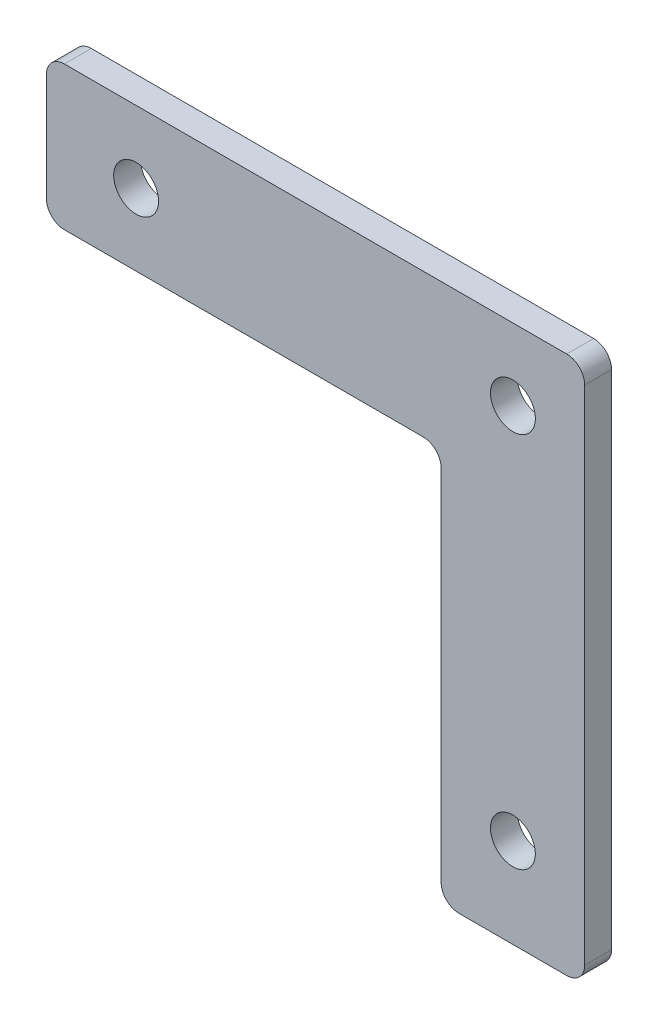
ISO-10303-21;
HEADER;
FILE_DESCRIPTION(('STEP AP214'),'2;1');
FILE_NAME('part.step','',(''),(''),'','','');
FILE_SCHEMA(('AUTOMOTIVE_DESIGN { 1 0 10303 214 1 1 1 1 }'));
ENDSEC;
DATA;
#1=APPLICATION_CONTEXT('core data for automotive mechanical design processes');
#2=APPLICATION_PROTOCOL_DEFINITION('international standard','automotive_design',2000,#1);
#3=PRODUCT_CONTEXT('',#1,'mechanical');
#4=PRODUCT('Part','Part','',(#3));
#5=PRODUCT_RELATED_PRODUCT_CATEGORY('part','',(#4));
#6=PRODUCT_DEFINITION_FORMATION('','',#4);
#7=PRODUCT_DEFINITION_CONTEXT('part definition',#1,'design');
#8=PRODUCT_DEFINITION('design','',#6,#7);
#9=PRODUCT_DEFINITION_SHAPE('','',#8);
#10=(LENGTH_UNIT() NAMED_UNIT(*) SI_UNIT(.MILLI.,.METRE.));
#11=(NAMED_UNIT(*) PLANE_ANGLE_UNIT() SI_UNIT($,.RADIAN.));
#12=(NAMED_UNIT(*) SI_UNIT($,.STERADIAN.) SOLID_ANGLE_UNIT());
#13=UNCERTAINTY_MEASURE_WITH_UNIT(LENGTH_MEASURE(1.E-05),#10,'distance_accuracy_value','');
#14=(GEOMETRIC_REPRESENTATION_CONTEXT(3) GLOBAL_UNCERTAINTY_ASSIGNED_CONTEXT((#13)) GLOBAL_UNIT_ASSIGNED_CONTEXT((#10,
#11,#12)) REPRESENTATION_CONTEXT('',''));
#15=CARTESIAN_POINT('',(0.,0.,0.));
#16=DIRECTION('',(0.,0.,1.));
#17=DIRECTION('',(1.,0.,0.));
#18=AXIS2_PLACEMENT_3D('',#15,#16,#17);
#19=CARTESIAN_POINT('',(0.,0.,3.));
#20=DIRECTION('',(1.,0.,0.));
#21=DIRECTION('',(0.,0.,-1.));
#22=AXIS2_PLACEMENT_3D('',#19,#20,#21);
#23=PLANE('',#22);
#24=DIRECTION('',(0.,-1.,0.));
#25=VECTOR('',#24,1.);
#26=CARTESIAN_POINT('',(0.,0.,3.));
#27=LINE('',#26,#25);
#28=CARTESIAN_POINT('',(0.,14.,3.));
#29=VERTEX_POINT('',#28);
#30=CARTESIAN_POINT('',(0.,2.,3.));
#31=VERTEX_POINT('',#30);
#32=EDGE_CURVE('E159',#29,#31,#27,.T.);
#33=ORIENTED_EDGE('',*,*,#32,.F.);
#34=DIRECTION('',(0.,0.,-1.));
#35=VECTOR('',#34,1.);
#36=CARTESIAN_POINT('',(0.,14.,3.));
#37=LINE('',#36,#35);
#38=CARTESIAN_POINT('',(0.,14.,0.));
#39=VERTEX_POINT('',#38);
#40=EDGE_CURVE('E196',#29,#39,#37,.T.);
#41=ORIENTED_EDGE('',*,*,#40,.T.);
#42=DIRECTION('',(0.,-1.,0.));
#43=VECTOR('',#42,1.);
#44=CARTESIAN_POINT('',(0.,0.,0.));
#45=LINE('',#44,#43);
#46=CARTESIAN_POINT('',(0.,2.,0.));
#47=VERTEX_POINT('',#46);
#48=EDGE_CURVE('E208',#39,#47,#45,.T.);
#49=ORIENTED_EDGE('',*,*,#48,.T.);
#50=DIRECTION('',(0.,0.,-1.));
#51=VECTOR('',#50,1.);
#52=CARTESIAN_POINT('',(0.,2.,3.));
#53=LINE('',#52,#51);
#54=EDGE_CURVE('E194',#47,#31,#53,.F.);
#55=ORIENTED_EDGE('',*,*,#54,.T.);
#56=EDGE_LOOP('',(#33,#41,#49,#55));
#57=FACE_BOUND('',#56,.T.);
#58=ADVANCED_FACE('F32',(#57),#23,.F.);
#59=CARTESIAN_POINT('',(0.,0.,3.));
#60=DIRECTION('',(0.,1.,0.));
#61=DIRECTION('',(0.,0.,1.));
#62=AXIS2_PLACEMENT_3D('',#59,#60,#61);
#63=PLANE('',#62);
#64=DIRECTION('',(1.,0.,0.));
#65=VECTOR('',#64,1.);
#66=CARTESIAN_POINT('',(0.,0.,0.));
#67=LINE('',#66,#65);
#68=CARTESIAN_POINT('',(2.,0.,0.));
#69=VERTEX_POINT('',#68);
#70=CARTESIAN_POINT('',(42.,0.,0.));
#71=VERTEX_POINT('',#70);
#72=EDGE_CURVE('E154',#69,#71,#67,.T.);
#73=ORIENTED_EDGE('',*,*,#72,.T.);
#74=DIRECTION('',(0.,0.,-1.));
#75=VECTOR('',#74,1.);
#76=CARTESIAN_POINT('',(42.,0.,3.));
#77=LINE('',#76,#75);
#78=CARTESIAN_POINT('',(42.,0.,3.));
#79=VERTEX_POINT('',#78);
#80=EDGE_CURVE('E188',#71,#79,#77,.F.);
#81=ORIENTED_EDGE('',*,*,#80,.T.);
#82=DIRECTION('',(1.,0.,0.));
#83=VECTOR('',#82,1.);
#84=CARTESIAN_POINT('',(0.,0.,3.));
#85=LINE('',#84,#83);
#86=CARTESIAN_POINT('',(2.,0.,3.));
#87=VERTEX_POINT('',#86);
#88=EDGE_CURVE('E215',#87,#79,#85,.T.);
#89=ORIENTED_EDGE('',*,*,#88,.F.);
#90=DIRECTION('',(0.,0.,-1.));
#91=VECTOR('',#90,1.);
#92=CARTESIAN_POINT('',(2.,0.,3.));
#93=LINE('',#92,#91);
#94=EDGE_CURVE('E185',#87,#69,#93,.T.);
#95=ORIENTED_EDGE('',*,*,#94,.T.);
#96=EDGE_LOOP('',(#73,#81,#89,#95));
#97=FACE_BOUND('',#96,.T.);
#98=ADVANCED_FACE('F204',(#97),#63,.F.);
#99=CARTESIAN_POINT('',(44.,0.,3.));
#100=DIRECTION('',(1.,0.,0.));
#101=DIRECTION('',(0.,1.,0.));
#102=AXIS2_PLACEMENT_3D('',#99,#100,#101);
#103=PLANE('',#102);
#104=DIRECTION('',(0.,-1.,0.));
#105=VECTOR('',#104,1.);
#106=CARTESIAN_POINT('',(44.,0.,0.));
#107=LINE('',#106,#105);
#108=CARTESIAN_POINT('',(44.,-2.,0.));
#109=VERTEX_POINT('',#108);
#110=CARTESIAN_POINT('',(44.,-42.,0.));
#111=VERTEX_POINT('',#110);
#112=EDGE_CURVE('E149',#109,#111,#107,.T.);
#113=ORIENTED_EDGE('',*,*,#112,.T.);
#114=DIRECTION('',(0.,0.,-1.));
#115=VECTOR('',#114,1.);
#116=CARTESIAN_POINT('',(44.,-42.,3.));
#117=LINE('',#116,#115);
#118=CARTESIAN_POINT('',(44.,-42.,3.));
#119=VERTEX_POINT('',#118);
#120=EDGE_CURVE('E127',#111,#119,#117,.F.);
#121=ORIENTED_EDGE('',*,*,#120,.T.);
#122=DIRECTION('',(0.,-1.,0.));
#123=VECTOR('',#122,1.);
#124=CARTESIAN_POINT('',(44.,0.,3.));
#125=LINE('',#124,#123);
#126=CARTESIAN_POINT('',(44.,-2.,3.));
#127=VERTEX_POINT('',#126);
#128=EDGE_CURVE('E214',#127,#119,#125,.T.);
#129=ORIENTED_EDGE('',*,*,#128,.F.);
#130=DIRECTION('',(0.,0.,-1.));
#131=VECTOR('',#130,1.);
#132=CARTESIAN_POINT('',(44.,-2.,0.));
#133=LINE('',#132,#131);
#134=EDGE_CURVE('E132',#127,#109,#133,.T.);
#135=ORIENTED_EDGE('',*,*,#134,.T.);
#136=EDGE_LOOP('',(#113,#121,#129,#135));
#137=FACE_BOUND('',#136,.T.);
#138=ADVANCED_FACE('F217',(#137),#103,.F.);
#139=CARTESIAN_POINT('',(60.,-44.,3.));
#140=DIRECTION('',(0.,1.,0.));
#141=DIRECTION('',(-1.,0.,0.));
#142=AXIS2_PLACEMENT_3D('',#139,#140,#141);
#143=PLANE('',#142);
#144=DIRECTION('',(1.,0.,0.));
#145=VECTOR('',#144,1.);
#146=CARTESIAN_POINT('',(60.,-44.,3.));
#147=LINE('',#146,#145);
#148=CARTESIAN_POINT('',(46.,-44.,3.));
#149=VERTEX_POINT('',#148);
#150=CARTESIAN_POINT('',(58.,-44.,3.));
#151=VERTEX_POINT('',#150);
#152=EDGE_CURVE('E142',#149,#151,#147,.T.);
#153=ORIENTED_EDGE('',*,*,#152,.F.);
#154=DIRECTION('',(0.,0.,-1.));
#155=VECTOR('',#154,1.);
#156=CARTESIAN_POINT('',(46.,-44.,3.));
#157=LINE('',#156,#155);
#158=CARTESIAN_POINT('',(46.,-44.,0.));
#159=VERTEX_POINT('',#158);
#160=EDGE_CURVE('E126',#149,#159,#157,.T.);
#161=ORIENTED_EDGE('',*,*,#160,.T.);
#162=DIRECTION('',(1.,0.,0.));
#163=VECTOR('',#162,1.);
#164=CARTESIAN_POINT('',(60.,-44.,0.));
#165=LINE('',#164,#163);
#166=CARTESIAN_POINT('',(58.,-44.,0.));
#167=VERTEX_POINT('',#166);
#168=EDGE_CURVE('E139',#159,#167,#165,.T.);
#169=ORIENTED_EDGE('',*,*,#168,.T.);
#170=DIRECTION('',(0.,0.,-1.));
#171=VECTOR('',#170,1.);
#172=CARTESIAN_POINT('',(58.,-44.,3.));
#173=LINE('',#172,#171);
#174=EDGE_CURVE('E144',#167,#151,#173,.F.);
#175=ORIENTED_EDGE('',*,*,#174,.T.);
#176=EDGE_LOOP('',(#153,#161,#169,#175));
#177=FACE_BOUND('',#176,.T.);
#178=ADVANCED_FACE('F138',(#177),#143,.F.);
#179=CARTESIAN_POINT('',(60.,-15.6568041730529,3.));
#180=DIRECTION('',(-1.,0.,0.));
#181=DIRECTION('',(0.,0.,1.));
#182=AXIS2_PLACEMENT_3D('',#179,#180,#181);
#183=PLANE('',#182);
#184=DIRECTION('',(0.,1.,0.));
#185=VECTOR('',#184,1.);
#186=CARTESIAN_POINT('',(60.,-15.6568041730529,3.));
#187=LINE('',#186,#185);
#188=CARTESIAN_POINT('',(60.,-42.,3.));
#189=VERTEX_POINT('',#188);
#190=CARTESIAN_POINT('',(60.,14.,3.));
#191=VERTEX_POINT('',#190);
#192=EDGE_CURVE('E219',#189,#191,#187,.T.);
#193=ORIENTED_EDGE('',*,*,#192,.F.);
#194=DIRECTION('',(0.,0.,-1.));
#195=VECTOR('',#194,1.);
#196=CARTESIAN_POINT('',(60.,-42.,3.));
#197=LINE('',#196,#195);
#198=CARTESIAN_POINT('',(60.,-42.,0.));
#199=VERTEX_POINT('',#198);
#200=EDGE_CURVE('E182',#189,#199,#197,.T.);
#201=ORIENTED_EDGE('',*,*,#200,.T.);
#202=DIRECTION('',(0.,1.,0.));
#203=VECTOR('',#202,1.);
#204=CARTESIAN_POINT('',(60.,-15.6568041730529,0.));
#205=LINE('',#204,#203);
#206=CARTESIAN_POINT('',(60.,14.,0.));
#207=VERTEX_POINT('',#206);
#208=EDGE_CURVE('E148',#199,#207,#205,.T.);
#209=ORIENTED_EDGE('',*,*,#208,.T.);
#210=DIRECTION('',(0.,0.,-1.));
#211=VECTOR('',#210,1.);
#212=CARTESIAN_POINT('',(60.,14.,3.));
#213=LINE('',#212,#211);
#214=EDGE_CURVE('E180',#207,#191,#213,.F.);
#215=ORIENTED_EDGE('',*,*,#214,.T.);
#216=EDGE_LOOP('',(#193,#201,#209,#215));
#217=FACE_BOUND('',#216,.T.);
#218=ADVANCED_FACE('F308',(#217),#183,.F.);
#219=CARTESIAN_POINT('',(0.,16.,3.));
#220=DIRECTION('',(0.,-1.,0.));
#221=DIRECTION('',(0.,0.,-1.));
#222=AXIS2_PLACEMENT_3D('',#219,#220,#221);
#223=PLANE('',#222);
#224=DIRECTION('',(-1.,0.,0.));
#225=VECTOR('',#224,1.);
#226=CARTESIAN_POINT('',(0.,16.,3.));
#227=LINE('',#226,#225);
#228=CARTESIAN_POINT('',(58.,16.,3.));
#229=VERTEX_POINT('',#228);
#230=CARTESIAN_POINT('',(2.,16.,3.));
#231=VERTEX_POINT('',#230);
#232=EDGE_CURVE('E160',#229,#231,#227,.T.);
#233=ORIENTED_EDGE('',*,*,#232,.F.);
#234=DIRECTION('',(0.,0.,-1.));
#235=VECTOR('',#234,1.);
#236=CARTESIAN_POINT('',(58.,16.,3.));
#237=LINE('',#236,#235);
#238=CARTESIAN_POINT('',(58.,16.,0.));
#239=VERTEX_POINT('',#238);
#240=EDGE_CURVE('E191',#229,#239,#237,.T.);
#241=ORIENTED_EDGE('',*,*,#240,.T.);
#242=DIRECTION('',(-1.,0.,0.));
#243=VECTOR('',#242,1.);
#244=CARTESIAN_POINT('',(0.,16.,0.));
#245=LINE('',#244,#243);
#246=CARTESIAN_POINT('',(2.,16.,0.));
#247=VERTEX_POINT('',#246);
#248=EDGE_CURVE('E152',#239,#247,#245,.T.);
#249=ORIENTED_EDGE('',*,*,#248,.T.);
#250=DIRECTION('',(0.,0.,-1.));
#251=VECTOR('',#250,1.);
#252=CARTESIAN_POINT('',(2.,16.,3.));
#253=LINE('',#252,#251);
#254=EDGE_CURVE('E47',#247,#231,#253,.F.);
#255=ORIENTED_EDGE('',*,*,#254,.T.);
#256=EDGE_LOOP('',(#233,#241,#249,#255));
#257=FACE_BOUND('',#256,.T.);
#258=ADVANCED_FACE('F255',(#257),#223,.F.);
#259=CARTESIAN_POINT('',(0.,0.,3.));
#260=DIRECTION('',(0.,0.,-1.));
#261=DIRECTION('',(-1.,0.,0.));
#262=AXIS2_PLACEMENT_3D('',#259,#260,#261);
#263=PLANE('',#262);
#264=CARTESIAN_POINT('',(52.,8.,3.));
#265=DIRECTION('',(0.,0.,-1.));
#266=DIRECTION('',(-1.,0.,0.));
#267=AXIS2_PLACEMENT_3D('',#264,#265,#266);
#268=CIRCLE('',#267,2.5);
#269=CARTESIAN_POINT('',(49.5,8.,3.));
#270=VERTEX_POINT('',#269);
#271=EDGE_CURVE('E240',#270,#270,#268,.T.);
#272=ORIENTED_EDGE('',*,*,#271,.T.);
#273=EDGE_LOOP('',(#272));
#274=FACE_BOUND('',#273,.T.);
#275=CARTESIAN_POINT('',(10.,8.,3.));
#276=DIRECTION('',(0.,0.,1.));
#277=DIRECTION('',(1.,0.,0.));
#278=AXIS2_PLACEMENT_3D('',#275,#276,#277);
#279=CIRCLE('',#278,2.5);
#280=CARTESIAN_POINT('',(12.5,8.,3.));
#281=VERTEX_POINT('',#280);
#282=EDGE_CURVE('E232',#281,#281,#279,.T.);
#283=ORIENTED_EDGE('',*,*,#282,.F.);
#284=EDGE_LOOP('',(#283));
#285=FACE_BOUND('',#284,.T.);
#286=CARTESIAN_POINT('',(52.,-34.,3.));
#287=DIRECTION('',(0.,0.,1.));
#288=DIRECTION('',(1.,0.,0.));
#289=AXIS2_PLACEMENT_3D('',#286,#287,#288);
#290=CIRCLE('',#289,2.5);
#291=CARTESIAN_POINT('',(54.5,-34.,3.));
#292=VERTEX_POINT('',#291);
#293=EDGE_CURVE('E245',#292,#292,#290,.T.);
#294=ORIENTED_EDGE('',*,*,#293,.F.);
#295=EDGE_LOOP('',(#294));
#296=FACE_BOUND('',#295,.T.);
#297=ORIENTED_EDGE('',*,*,#128,.T.);
#298=CARTESIAN_POINT('',(46.,-42.,3.));
#299=DIRECTION('',(0.,0.,-1.));
#300=DIRECTION('',(-1.,0.,0.));
#301=AXIS2_PLACEMENT_3D('',#298,#299,#300);
#302=CIRCLE('',#301,2.);
#303=EDGE_CURVE('E178',#119,#149,#302,.F.);
#304=ORIENTED_EDGE('',*,*,#303,.T.);
#305=ORIENTED_EDGE('',*,*,#152,.T.);
#306=CARTESIAN_POINT('',(58.,-42.,3.));
#307=DIRECTION('',(0.,0.,-1.));
#308=DIRECTION('',(-1.,0.,0.));
#309=AXIS2_PLACEMENT_3D('',#306,#307,#308);
#310=CIRCLE('',#309,2.);
#311=EDGE_CURVE('E176',#151,#189,#310,.F.);
#312=ORIENTED_EDGE('',*,*,#311,.T.);
#313=ORIENTED_EDGE('',*,*,#192,.T.);
#314=CARTESIAN_POINT('',(58.,14.,3.));
#315=DIRECTION('',(0.,0.,-1.));
#316=DIRECTION('',(-1.,0.,0.));
#317=AXIS2_PLACEMENT_3D('',#314,#315,#316);
#318=CIRCLE('',#317,2.);
#319=EDGE_CURVE('E54',#191,#229,#318,.F.);
#320=ORIENTED_EDGE('',*,*,#319,.T.);
#321=ORIENTED_EDGE('',*,*,#232,.T.);
#322=CARTESIAN_POINT('',(2.,14.,3.));
#323=DIRECTION('',(0.,0.,-1.));
#324=DIRECTION('',(-1.,0.,0.));
#325=AXIS2_PLACEMENT_3D('',#322,#323,#324);
#326=CIRCLE('',#325,2.);
#327=EDGE_CURVE('E173',#231,#29,#326,.F.);
#328=ORIENTED_EDGE('',*,*,#327,.T.);
#329=ORIENTED_EDGE('',*,*,#32,.T.);
#330=CARTESIAN_POINT('',(2.,2.,3.));
#331=DIRECTION('',(0.,0.,-1.));
#332=DIRECTION('',(-1.,0.,0.));
#333=AXIS2_PLACEMENT_3D('',#330,#331,#332);
#334=CIRCLE('',#333,2.);
#335=EDGE_CURVE('E171',#31,#87,#334,.F.);
#336=ORIENTED_EDGE('',*,*,#335,.T.);
#337=ORIENTED_EDGE('',*,*,#88,.T.);
#338=CARTESIAN_POINT('',(42.,-2.,3.));
#339=DIRECTION('',(0.,0.,-1.));
#340=DIRECTION('',(-1.,0.,0.));
#341=AXIS2_PLACEMENT_3D('',#338,#339,#340);
#342=CIRCLE('',#341,2.);
#343=EDGE_CURVE('E11',#79,#127,#342,.T.);
#344=ORIENTED_EDGE('',*,*,#343,.T.);
#345=EDGE_LOOP('',(#297,#304,#305,#312,#313,#320,#321,#328,#329,#336,#337,#344));
#346=FACE_BOUND('',#345,.T.);
#347=ADVANCED_FACE('F213',(#274,#285,#296,#346),#263,.F.);
#348=CARTESIAN_POINT('',(0.,0.,0.));
#349=DIRECTION('',(0.,0.,-1.));
#350=DIRECTION('',(-1.,0.,0.));
#351=AXIS2_PLACEMENT_3D('',#348,#349,#350);
#352=PLANE('',#351);
#353=CARTESIAN_POINT('',(52.,8.,0.));
#354=DIRECTION('',(0.,0.,-1.));
#355=DIRECTION('',(-1.,0.,0.));
#356=AXIS2_PLACEMENT_3D('',#353,#354,#355);
#357=CIRCLE('',#356,2.5);
#358=CARTESIAN_POINT('',(49.5,8.,0.));
#359=VERTEX_POINT('',#358);
#360=EDGE_CURVE('E417',#359,#359,#357,.T.);
#361=ORIENTED_EDGE('',*,*,#360,.F.);
#362=EDGE_LOOP('',(#361));
#363=FACE_BOUND('',#362,.T.);
#364=CARTESIAN_POINT('',(10.,8.,0.));
#365=DIRECTION('',(0.,0.,1.));
#366=DIRECTION('',(1.,0.,0.));
#367=AXIS2_PLACEMENT_3D('',#364,#365,#366);
#368=CIRCLE('',#367,2.5);
#369=CARTESIAN_POINT('',(12.5,8.,0.));
#370=VERTEX_POINT('',#369);
#371=EDGE_CURVE('E227',#370,#370,#368,.T.);
#372=ORIENTED_EDGE('',*,*,#371,.T.);
#373=EDGE_LOOP('',(#372));
#374=FACE_BOUND('',#373,.T.);
#375=CARTESIAN_POINT('',(52.,-34.,0.));
#376=DIRECTION('',(0.,0.,1.));
#377=DIRECTION('',(1.,0.,0.));
#378=AXIS2_PLACEMENT_3D('',#375,#376,#377);
#379=CIRCLE('',#378,2.5);
#380=CARTESIAN_POINT('',(54.5,-34.,0.));
#381=VERTEX_POINT('',#380);
#382=EDGE_CURVE('E237',#381,#381,#379,.T.);
#383=ORIENTED_EDGE('',*,*,#382,.T.);
#384=EDGE_LOOP('',(#383));
#385=FACE_BOUND('',#384,.T.);
#386=ORIENTED_EDGE('',*,*,#168,.F.);
#387=CARTESIAN_POINT('',(46.,-42.,0.));
#388=DIRECTION('',(0.,0.,-1.));
#389=DIRECTION('',(-1.,0.,0.));
#390=AXIS2_PLACEMENT_3D('',#387,#388,#389);
#391=CIRCLE('',#390,2.);
#392=EDGE_CURVE('E122',#159,#111,#391,.T.);
#393=ORIENTED_EDGE('',*,*,#392,.T.);
#394=ORIENTED_EDGE('',*,*,#112,.F.);
#395=CARTESIAN_POINT('',(42.,-2.,0.));
#396=DIRECTION('',(0.,0.,-1.));
#397=DIRECTION('',(-1.,0.,0.));
#398=AXIS2_PLACEMENT_3D('',#395,#396,#397);
#399=CIRCLE('',#398,2.);
#400=EDGE_CURVE('E40',#109,#71,#399,.F.);
#401=ORIENTED_EDGE('',*,*,#400,.T.);
#402=ORIENTED_EDGE('',*,*,#72,.F.);
#403=CARTESIAN_POINT('',(2.,2.,0.));
#404=DIRECTION('',(0.,0.,-1.));
#405=DIRECTION('',(-1.,0.,0.));
#406=AXIS2_PLACEMENT_3D('',#403,#404,#405);
#407=CIRCLE('',#406,2.);
#408=EDGE_CURVE('E143',#69,#47,#407,.T.);
#409=ORIENTED_EDGE('',*,*,#408,.T.);
#410=ORIENTED_EDGE('',*,*,#48,.F.);
#411=CARTESIAN_POINT('',(2.,14.,0.));
#412=DIRECTION('',(0.,0.,-1.));
#413=DIRECTION('',(-1.,0.,0.));
#414=AXIS2_PLACEMENT_3D('',#411,#412,#413);
#415=CIRCLE('',#414,2.);
#416=EDGE_CURVE('E163',#39,#247,#415,.T.);
#417=ORIENTED_EDGE('',*,*,#416,.T.);
#418=ORIENTED_EDGE('',*,*,#248,.F.);
#419=CARTESIAN_POINT('',(58.,14.,0.));
#420=DIRECTION('',(0.,0.,-1.));
#421=DIRECTION('',(-1.,0.,0.));
#422=AXIS2_PLACEMENT_3D('',#419,#420,#421);
#423=CIRCLE('',#422,2.);
#424=EDGE_CURVE('E165',#239,#207,#423,.T.);
#425=ORIENTED_EDGE('',*,*,#424,.T.);
#426=ORIENTED_EDGE('',*,*,#208,.F.);
#427=CARTESIAN_POINT('',(58.,-42.,0.));
#428=DIRECTION('',(0.,0.,-1.));
#429=DIRECTION('',(-1.,0.,0.));
#430=AXIS2_PLACEMENT_3D('',#427,#428,#429);
#431=CIRCLE('',#430,2.);
#432=EDGE_CURVE('E133',#199,#167,#431,.T.);
#433=ORIENTED_EDGE('',*,*,#432,.T.);
#434=EDGE_LOOP('',(#386,#393,#394,#401,#402,#409,#410,#417,#418,#425,#426,#433));
#435=FACE_BOUND('',#434,.T.);
#436=ADVANCED_FACE('F146',(#363,#374,#385,#435),#352,.T.);
#437=CARTESIAN_POINT('',(52.,-34.,0.));
#438=DIRECTION('',(0.,0.,1.));
#439=DIRECTION('',(1.,0.,0.));
#440=AXIS2_PLACEMENT_3D('',#437,#438,#439);
#441=CYLINDRICAL_SURFACE('',#440,2.5);
#442=ORIENTED_EDGE('',*,*,#382,.F.);
#443=EDGE_LOOP('',(#442));
#444=FACE_BOUND('',#443,.T.);
#445=ORIENTED_EDGE('',*,*,#293,.T.);
#446=EDGE_LOOP('',(#445));
#447=FACE_BOUND('',#446,.T.);
#448=ADVANCED_FACE('F295',(#444,#447),#441,.F.);
#449=CARTESIAN_POINT('',(10.,8.,0.));
#450=DIRECTION('',(0.,0.,1.));
#451=DIRECTION('',(1.,0.,0.));
#452=AXIS2_PLACEMENT_3D('',#449,#450,#451);
#453=CYLINDRICAL_SURFACE('',#452,2.5);
#454=ORIENTED_EDGE('',*,*,#371,.F.);
#455=EDGE_LOOP('',(#454));
#456=FACE_BOUND('',#455,.T.);
#457=ORIENTED_EDGE('',*,*,#282,.T.);
#458=EDGE_LOOP('',(#457));
#459=FACE_BOUND('',#458,.T.);
#460=ADVANCED_FACE('F269',(#456,#459),#453,.F.);
#461=CARTESIAN_POINT('',(46.,-42.,3.));
#462=DIRECTION('',(0.,0.,-1.));
#463=DIRECTION('',(-1.,0.,0.));
#464=AXIS2_PLACEMENT_3D('',#461,#462,#463);
#465=CYLINDRICAL_SURFACE('',#464,2.);
#466=ORIENTED_EDGE('',*,*,#303,.F.);
#467=ORIENTED_EDGE('',*,*,#120,.F.);
#468=ORIENTED_EDGE('',*,*,#392,.F.);
#469=ORIENTED_EDGE('',*,*,#160,.F.);
#470=EDGE_LOOP('',(#466,#467,#468,#469));
#471=FACE_BOUND('',#470,.T.);
#472=ADVANCED_FACE('F125',(#471),#465,.T.);
#473=CARTESIAN_POINT('',(58.,-42.,3.));
#474=DIRECTION('',(0.,0.,-1.));
#475=DIRECTION('',(-1.,0.,0.));
#476=AXIS2_PLACEMENT_3D('',#473,#474,#475);
#477=CYLINDRICAL_SURFACE('',#476,2.);
#478=ORIENTED_EDGE('',*,*,#311,.F.);
#479=ORIENTED_EDGE('',*,*,#174,.F.);
#480=ORIENTED_EDGE('',*,*,#432,.F.);
#481=ORIENTED_EDGE('',*,*,#200,.F.);
#482=EDGE_LOOP('',(#478,#479,#480,#481));
#483=FACE_BOUND('',#482,.T.);
#484=ADVANCED_FACE('F268',(#483),#477,.T.);
#485=CARTESIAN_POINT('',(42.,-2.,3.));
#486=DIRECTION('',(0.,0.,1.));
#487=DIRECTION('',(1.,0.,0.));
#488=AXIS2_PLACEMENT_3D('',#485,#486,#487);
#489=CYLINDRICAL_SURFACE('',#488,2.);
#490=ORIENTED_EDGE('',*,*,#343,.F.);
#491=ORIENTED_EDGE('',*,*,#80,.F.);
#492=ORIENTED_EDGE('',*,*,#400,.F.);
#493=ORIENTED_EDGE('',*,*,#134,.F.);
#494=EDGE_LOOP('',(#490,#491,#492,#493));
#495=FACE_BOUND('',#494,.T.);
#496=ADVANCED_FACE('F210',(#495),#489,.F.);
#497=CARTESIAN_POINT('',(58.,14.,3.));
#498=DIRECTION('',(0.,0.,-1.));
#499=DIRECTION('',(-1.,0.,0.));
#500=AXIS2_PLACEMENT_3D('',#497,#498,#499);
#501=CYLINDRICAL_SURFACE('',#500,2.);
#502=ORIENTED_EDGE('',*,*,#319,.F.);
#503=ORIENTED_EDGE('',*,*,#214,.F.);
#504=ORIENTED_EDGE('',*,*,#424,.F.);
#505=ORIENTED_EDGE('',*,*,#240,.F.);
#506=EDGE_LOOP('',(#502,#503,#504,#505));
#507=FACE_BOUND('',#506,.T.);
#508=ADVANCED_FACE('F275',(#507),#501,.T.);
#509=CARTESIAN_POINT('',(2.,14.,3.));
#510=DIRECTION('',(0.,0.,-1.));
#511=DIRECTION('',(-1.,0.,0.));
#512=AXIS2_PLACEMENT_3D('',#509,#510,#511);
#513=CYLINDRICAL_SURFACE('',#512,2.);
#514=ORIENTED_EDGE('',*,*,#327,.F.);
#515=ORIENTED_EDGE('',*,*,#254,.F.);
#516=ORIENTED_EDGE('',*,*,#416,.F.);
#517=ORIENTED_EDGE('',*,*,#40,.F.);
#518=EDGE_LOOP('',(#514,#515,#516,#517));
#519=FACE_BOUND('',#518,.T.);
#520=ADVANCED_FACE('F257',(#519),#513,.T.);
#521=CARTESIAN_POINT('',(2.,2.,3.));
#522=DIRECTION('',(0.,0.,-1.));
#523=DIRECTION('',(-1.,0.,0.));
#524=AXIS2_PLACEMENT_3D('',#521,#522,#523);
#525=CYLINDRICAL_SURFACE('',#524,2.);
#526=ORIENTED_EDGE('',*,*,#335,.F.);
#527=ORIENTED_EDGE('',*,*,#54,.F.);
#528=ORIENTED_EDGE('',*,*,#408,.F.);
#529=ORIENTED_EDGE('',*,*,#94,.F.);
#530=EDGE_LOOP('',(#526,#527,#528,#529));
#531=FACE_BOUND('',#530,.T.);
#532=ADVANCED_FACE('F34',(#531),#525,.T.);
#533=CARTESIAN_POINT('',(52.,8.,0.));
#534=DIRECTION('',(0.,0.,-1.));
#535=DIRECTION('',(-1.,0.,0.));
#536=AXIS2_PLACEMENT_3D('',#533,#534,#535);
#537=CYLINDRICAL_SURFACE('',#536,2.5);
#538=ORIENTED_EDGE('',*,*,#271,.F.);
#539=EDGE_LOOP('',(#538));
#540=FACE_BOUND('',#539,.T.);
#541=ORIENTED_EDGE('',*,*,#360,.T.);
#542=EDGE_LOOP('',(#541));
#543=FACE_BOUND('',#542,.T.);
#544=ADVANCED_FACE('F282',(#540,#543),#537,.F.);
#545=CLOSED_SHELL('',(#58,#98,#138,#178,#218,#258,#347,#436,#448,#460,#472,#484,#496,#508,#520,
#532,#544));
#546=MANIFOLD_SOLID_BREP('B2',#545);
#547=ADVANCED_BREP_SHAPE_REPRESENTATION('',(#18,#546),#14);
#548=SHAPE_DEFINITION_REPRESENTATION(#9,#547);
ENDSEC;
END-ISO-10303-21;
